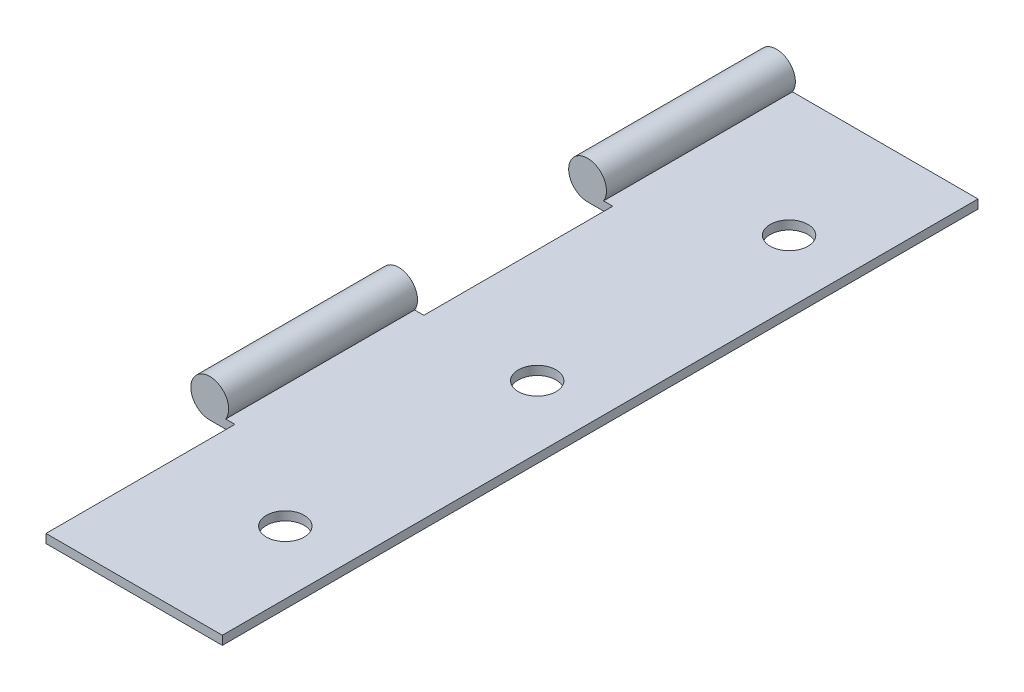
ISO-10303-21;
HEADER;
FILE_DESCRIPTION(('STEP AP214'),'2;1');
FILE_NAME('part.step','',(''),(''),'','','');
FILE_SCHEMA(('AUTOMOTIVE_DESIGN { 1 0 10303 214 1 1 1 1 }'));
ENDSEC;
DATA;
#1=APPLICATION_CONTEXT('core data for automotive mechanical design processes');
#2=APPLICATION_PROTOCOL_DEFINITION('international standard','automotive_design',2000,#1);
#3=PRODUCT_CONTEXT('',#1,'mechanical');
#4=PRODUCT('Part','Part','',(#3));
#5=PRODUCT_RELATED_PRODUCT_CATEGORY('part','',(#4));
#6=PRODUCT_DEFINITION_FORMATION('','',#4);
#7=PRODUCT_DEFINITION_CONTEXT('part definition',#1,'design');
#8=PRODUCT_DEFINITION('design','',#6,#7);
#9=PRODUCT_DEFINITION_SHAPE('','',#8);
#10=(LENGTH_UNIT() NAMED_UNIT(*) SI_UNIT(.MILLI.,.METRE.));
#11=(NAMED_UNIT(*) PLANE_ANGLE_UNIT() SI_UNIT($,.RADIAN.));
#12=(NAMED_UNIT(*) SI_UNIT($,.STERADIAN.) SOLID_ANGLE_UNIT());
#13=UNCERTAINTY_MEASURE_WITH_UNIT(LENGTH_MEASURE(1.E-05),#10,'distance_accuracy_value','');
#14=(GEOMETRIC_REPRESENTATION_CONTEXT(3) GLOBAL_UNCERTAINTY_ASSIGNED_CONTEXT((#13)) GLOBAL_UNIT_ASSIGNED_CONTEXT((#10,
#11,#12)) REPRESENTATION_CONTEXT('',''));
#15=CARTESIAN_POINT('',(0.,0.,0.));
#16=DIRECTION('',(0.,0.,1.));
#17=DIRECTION('',(1.,0.,0.));
#18=AXIS2_PLACEMENT_3D('',#15,#16,#17);
#19=CARTESIAN_POINT('',(0.,1.5,60.));
#20=DIRECTION('',(0.,0.,-1.));
#21=DIRECTION('',(-1.,0.,0.));
#22=AXIS2_PLACEMENT_3D('',#19,#20,#21);
#23=CYLINDRICAL_SURFACE('',#22,1.5);
#24=CARTESIAN_POINT('',(0.,1.5,15.));
#25=DIRECTION('',(0.,0.,1.));
#26=DIRECTION('',(1.,0.,0.));
#27=AXIS2_PLACEMENT_3D('',#24,#25,#26);
#28=CIRCLE('',#27,1.5);
#29=CARTESIAN_POINT('',(1.26885775404495,0.7,15.));
#30=VERTEX_POINT('',#29);
#31=CARTESIAN_POINT('',(0.,0.,15.));
#32=VERTEX_POINT('',#31);
#33=EDGE_CURVE('E238',#30,#32,#28,.T.);
#34=ORIENTED_EDGE('',*,*,#33,.F.);
#35=DIRECTION('',(0.,0.,-1.));
#36=VECTOR('',#35,1.);
#37=CARTESIAN_POINT('',(1.26885775404495,0.7,60.));
#38=LINE('',#37,#36);
#39=CARTESIAN_POINT('',(1.26885775404495,0.7,0.));
#40=VERTEX_POINT('',#39);
#41=EDGE_CURVE('E209',#30,#40,#38,.T.);
#42=ORIENTED_EDGE('',*,*,#41,.T.);
#43=CARTESIAN_POINT('',(0.,1.5,0.));
#44=DIRECTION('',(0.,0.,1.));
#45=DIRECTION('',(1.,0.,0.));
#46=AXIS2_PLACEMENT_3D('',#43,#44,#45);
#47=CIRCLE('',#46,1.5);
#48=CARTESIAN_POINT('',(0.,0.,0.));
#49=VERTEX_POINT('',#48);
#50=EDGE_CURVE('E202',#40,#49,#47,.T.);
#51=ORIENTED_EDGE('',*,*,#50,.T.);
#52=DIRECTION('',(0.,0.,-1.));
#53=VECTOR('',#52,1.);
#54=CARTESIAN_POINT('',(0.,0.,60.));
#55=LINE('',#54,#53);
#56=EDGE_CURVE('E212',#32,#49,#55,.T.);
#57=ORIENTED_EDGE('',*,*,#56,.F.);
#58=EDGE_LOOP('',(#34,#42,#51,#57));
#59=FACE_BOUND('',#58,.T.);
#60=ADVANCED_FACE('F31',(#59),#23,.T.);
#61=CARTESIAN_POINT('',(1.26885775404495,0.7,45.));
#62=VERTEX_POINT('',#61);
#63=CARTESIAN_POINT('',(1.26885775404495,0.7,30.));
#64=VERTEX_POINT('',#63);
#65=EDGE_CURVE('E199',#62,#64,#38,.T.);
#66=ORIENTED_EDGE('',*,*,#65,.T.);
#67=CARTESIAN_POINT('',(0.,1.5,30.));
#68=DIRECTION('',(0.,0.,-1.));
#69=DIRECTION('',(-1.,0.,0.));
#70=AXIS2_PLACEMENT_3D('',#67,#68,#69);
#71=CIRCLE('',#70,1.5);
#72=CARTESIAN_POINT('',(0.,0.,30.));
#73=VERTEX_POINT('',#72);
#74=EDGE_CURVE('E46',#73,#64,#71,.T.);
#75=ORIENTED_EDGE('',*,*,#74,.F.);
#76=CARTESIAN_POINT('',(0.,0.,45.));
#77=VERTEX_POINT('',#76);
#78=EDGE_CURVE('E213',#77,#73,#55,.T.);
#79=ORIENTED_EDGE('',*,*,#78,.F.);
#80=CARTESIAN_POINT('',(0.,1.5,45.));
#81=DIRECTION('',(0.,0.,1.));
#82=DIRECTION('',(1.,0.,0.));
#83=AXIS2_PLACEMENT_3D('',#80,#81,#82);
#84=CIRCLE('',#83,1.5);
#85=EDGE_CURVE('E221',#62,#77,#84,.T.);
#86=ORIENTED_EDGE('',*,*,#85,.F.);
#87=EDGE_LOOP('',(#66,#75,#79,#86));
#88=FACE_BOUND('',#87,.T.);
#89=ADVANCED_FACE('F158',(#88),#23,.T.);
#90=CARTESIAN_POINT('',(0.,0.,60.));
#91=DIRECTION('',(0.,1.,0.));
#92=DIRECTION('',(0.,0.,1.));
#93=AXIS2_PLACEMENT_3D('',#90,#91,#92);
#94=PLANE('',#93);
#95=CARTESIAN_POINT('',(11.,0.,30.));
#96=DIRECTION('',(0.,1.,0.));
#97=DIRECTION('',(-1.,0.,0.));
#98=AXIS2_PLACEMENT_3D('',#95,#96,#97);
#99=CIRCLE('',#98,1.5);
#100=CARTESIAN_POINT('',(9.5,0.,30.));
#101=VERTEX_POINT('',#100);
#102=EDGE_CURVE('E275',#101,#101,#99,.T.);
#103=ORIENTED_EDGE('',*,*,#102,.T.);
#104=EDGE_LOOP('',(#103));
#105=FACE_BOUND('',#104,.T.);
#106=CARTESIAN_POINT('',(11.,0.,50.));
#107=DIRECTION('',(0.,1.,0.));
#108=DIRECTION('',(-1.,0.,0.));
#109=AXIS2_PLACEMENT_3D('',#106,#107,#108);
#110=CIRCLE('',#109,1.5);
#111=CARTESIAN_POINT('',(9.5,0.,50.));
#112=VERTEX_POINT('',#111);
#113=EDGE_CURVE('E126',#112,#112,#110,.T.);
#114=ORIENTED_EDGE('',*,*,#113,.T.);
#115=EDGE_LOOP('',(#114));
#116=FACE_BOUND('',#115,.T.);
#117=DIRECTION('',(1.,0.,0.));
#118=VECTOR('',#117,1.);
#119=CARTESIAN_POINT('',(0.,0.,15.));
#120=LINE('',#119,#118);
#121=CARTESIAN_POINT('',(2.,0.,15.));
#122=VERTEX_POINT('',#121);
#123=EDGE_CURVE('E240',#32,#122,#120,.T.);
#124=ORIENTED_EDGE('',*,*,#123,.F.);
#125=ORIENTED_EDGE('',*,*,#56,.T.);
#126=DIRECTION('',(1.,0.,0.));
#127=VECTOR('',#126,1.);
#128=CARTESIAN_POINT('',(0.,0.,0.));
#129=LINE('',#128,#127);
#130=CARTESIAN_POINT('',(16.,0.,0.));
#131=VERTEX_POINT('',#130);
#132=EDGE_CURVE('E192',#49,#131,#129,.T.);
#133=ORIENTED_EDGE('',*,*,#132,.T.);
#134=DIRECTION('',(0.,0.,-1.));
#135=VECTOR('',#134,1.);
#136=CARTESIAN_POINT('',(16.,0.,60.));
#137=LINE('',#136,#135);
#138=CARTESIAN_POINT('',(16.,0.,60.));
#139=VERTEX_POINT('',#138);
#140=EDGE_CURVE('E188',#139,#131,#137,.T.);
#141=ORIENTED_EDGE('',*,*,#140,.F.);
#142=DIRECTION('',(1.,0.,0.));
#143=VECTOR('',#142,1.);
#144=CARTESIAN_POINT('',(0.,0.,60.));
#145=LINE('',#144,#143);
#146=CARTESIAN_POINT('',(2.,0.,60.));
#147=VERTEX_POINT('',#146);
#148=EDGE_CURVE('E203',#147,#139,#145,.T.);
#149=ORIENTED_EDGE('',*,*,#148,.F.);
#150=DIRECTION('',(0.,0.,1.));
#151=VECTOR('',#150,1.);
#152=CARTESIAN_POINT('',(2.,0.,60.));
#153=LINE('',#152,#151);
#154=CARTESIAN_POINT('',(2.,0.,45.));
#155=VERTEX_POINT('',#154);
#156=EDGE_CURVE('E54',#155,#147,#153,.T.);
#157=ORIENTED_EDGE('',*,*,#156,.F.);
#158=DIRECTION('',(1.,0.,0.));
#159=VECTOR('',#158,1.);
#160=CARTESIAN_POINT('',(0.,0.,45.));
#161=LINE('',#160,#159);
#162=EDGE_CURVE('E225',#77,#155,#161,.T.);
#163=ORIENTED_EDGE('',*,*,#162,.F.);
#164=ORIENTED_EDGE('',*,*,#78,.T.);
#165=DIRECTION('',(-1.,0.,0.));
#166=VECTOR('',#165,1.);
#167=CARTESIAN_POINT('',(0.,0.,30.));
#168=LINE('',#167,#166);
#169=CARTESIAN_POINT('',(2.,0.,30.));
#170=VERTEX_POINT('',#169);
#171=EDGE_CURVE('E241',#170,#73,#168,.T.);
#172=ORIENTED_EDGE('',*,*,#171,.F.);
#173=DIRECTION('',(0.,0.,1.));
#174=VECTOR('',#173,1.);
#175=CARTESIAN_POINT('',(2.,0.,60.));
#176=LINE('',#175,#174);
#177=EDGE_CURVE('E124',#122,#170,#176,.T.);
#178=ORIENTED_EDGE('',*,*,#177,.F.);
#179=EDGE_LOOP('',(#124,#125,#133,#141,#149,#157,#163,#164,#172,#178));
#180=FACE_BOUND('',#179,.T.);
#181=CARTESIAN_POINT('',(11.,0.,9.99999999999999));
#182=DIRECTION('',(0.,1.,0.));
#183=DIRECTION('',(-1.,0.,0.));
#184=AXIS2_PLACEMENT_3D('',#181,#182,#183);
#185=CIRCLE('',#184,1.5);
#186=CARTESIAN_POINT('',(9.5,0.,9.99999999999999));
#187=VERTEX_POINT('',#186);
#188=EDGE_CURVE('E39',#187,#187,#185,.T.);
#189=ORIENTED_EDGE('',*,*,#188,.T.);
#190=EDGE_LOOP('',(#189));
#191=FACE_BOUND('',#190,.T.);
#192=ADVANCED_FACE('F140',(#105,#116,#180,#191),#94,.F.);
#193=CARTESIAN_POINT('',(1.26885775404495,0.7,60.));
#194=DIRECTION('',(0.,-1.,0.));
#195=DIRECTION('',(1.,0.,0.));
#196=AXIS2_PLACEMENT_3D('',#193,#194,#195);
#197=PLANE('',#196);
#198=CARTESIAN_POINT('',(11.,0.7,30.));
#199=DIRECTION('',(0.,1.,0.));
#200=DIRECTION('',(-1.,0.,0.));
#201=AXIS2_PLACEMENT_3D('',#198,#199,#200);
#202=CIRCLE('',#201,1.5);
#203=CARTESIAN_POINT('',(9.5,0.7,30.));
#204=VERTEX_POINT('',#203);
#205=EDGE_CURVE('E277',#204,#204,#202,.T.);
#206=ORIENTED_EDGE('',*,*,#205,.F.);
#207=EDGE_LOOP('',(#206));
#208=FACE_BOUND('',#207,.T.);
#209=CARTESIAN_POINT('',(11.,0.7,50.));
#210=DIRECTION('',(0.,1.,0.));
#211=DIRECTION('',(-1.,0.,0.));
#212=AXIS2_PLACEMENT_3D('',#209,#210,#211);
#213=CIRCLE('',#212,1.5);
#214=CARTESIAN_POINT('',(9.5,0.7,50.));
#215=VERTEX_POINT('',#214);
#216=EDGE_CURVE('E278',#215,#215,#213,.T.);
#217=ORIENTED_EDGE('',*,*,#216,.F.);
#218=EDGE_LOOP('',(#217));
#219=FACE_BOUND('',#218,.T.);
#220=DIRECTION('',(-1.,0.,0.));
#221=VECTOR('',#220,1.);
#222=CARTESIAN_POINT('',(1.26885775404495,0.7,15.));
#223=LINE('',#222,#221);
#224=CARTESIAN_POINT('',(2.,0.7,15.));
#225=VERTEX_POINT('',#224);
#226=EDGE_CURVE('E133',#225,#30,#223,.T.);
#227=ORIENTED_EDGE('',*,*,#226,.F.);
#228=DIRECTION('',(0.,0.,-1.));
#229=VECTOR('',#228,1.);
#230=CARTESIAN_POINT('',(2.,0.7,60.));
#231=LINE('',#230,#229);
#232=CARTESIAN_POINT('',(2.,0.7,30.));
#233=VERTEX_POINT('',#232);
#234=EDGE_CURVE('E116',#233,#225,#231,.T.);
#235=ORIENTED_EDGE('',*,*,#234,.F.);
#236=DIRECTION('',(1.,0.,0.));
#237=VECTOR('',#236,1.);
#238=CARTESIAN_POINT('',(1.26885775404495,0.7,30.));
#239=LINE('',#238,#237);
#240=EDGE_CURVE('E107',#64,#233,#239,.T.);
#241=ORIENTED_EDGE('',*,*,#240,.F.);
#242=ORIENTED_EDGE('',*,*,#65,.F.);
#243=DIRECTION('',(-1.,0.,0.));
#244=VECTOR('',#243,1.);
#245=CARTESIAN_POINT('',(1.26885775404495,0.7,45.));
#246=LINE('',#245,#244);
#247=CARTESIAN_POINT('',(2.,0.7,45.));
#248=VERTEX_POINT('',#247);
#249=EDGE_CURVE('E117',#248,#62,#246,.T.);
#250=ORIENTED_EDGE('',*,*,#249,.F.);
#251=DIRECTION('',(0.,0.,-1.));
#252=VECTOR('',#251,1.);
#253=CARTESIAN_POINT('',(2.,0.7,60.));
#254=LINE('',#253,#252);
#255=CARTESIAN_POINT('',(2.,0.7,60.));
#256=VERTEX_POINT('',#255);
#257=EDGE_CURVE('E228',#256,#248,#254,.T.);
#258=ORIENTED_EDGE('',*,*,#257,.F.);
#259=DIRECTION('',(-1.,0.,0.));
#260=VECTOR('',#259,1.);
#261=CARTESIAN_POINT('',(1.26885775404495,0.7,60.));
#262=LINE('',#261,#260);
#263=CARTESIAN_POINT('',(16.,0.7,60.));
#264=VERTEX_POINT('',#263);
#265=EDGE_CURVE('E198',#264,#256,#262,.T.);
#266=ORIENTED_EDGE('',*,*,#265,.F.);
#267=DIRECTION('',(0.,0.,-1.));
#268=VECTOR('',#267,1.);
#269=CARTESIAN_POINT('',(16.,0.7,60.));
#270=LINE('',#269,#268);
#271=CARTESIAN_POINT('',(16.,0.7,0.));
#272=VERTEX_POINT('',#271);
#273=EDGE_CURVE('E185',#264,#272,#270,.T.);
#274=ORIENTED_EDGE('',*,*,#273,.T.);
#275=DIRECTION('',(-1.,0.,0.));
#276=VECTOR('',#275,1.);
#277=CARTESIAN_POINT('',(1.26885775404495,0.7,0.));
#278=LINE('',#277,#276);
#279=EDGE_CURVE('E191',#272,#40,#278,.T.);
#280=ORIENTED_EDGE('',*,*,#279,.T.);
#281=ORIENTED_EDGE('',*,*,#41,.F.);
#282=EDGE_LOOP('',(#227,#235,#241,#242,#250,#258,#266,#274,#280,#281));
#283=FACE_BOUND('',#282,.T.);
#284=CARTESIAN_POINT('',(11.,0.7,9.99999999999999));
#285=DIRECTION('',(0.,1.,0.));
#286=DIRECTION('',(-1.,0.,0.));
#287=AXIS2_PLACEMENT_3D('',#284,#285,#286);
#288=CIRCLE('',#287,1.5);
#289=CARTESIAN_POINT('',(9.5,0.7,9.99999999999999));
#290=VERTEX_POINT('',#289);
#291=EDGE_CURVE('E11',#290,#290,#288,.T.);
#292=ORIENTED_EDGE('',*,*,#291,.F.);
#293=EDGE_LOOP('',(#292));
#294=FACE_BOUND('',#293,.T.);
#295=ADVANCED_FACE('F129',(#208,#219,#283,#294),#197,.F.);
#296=CARTESIAN_POINT('',(0.,1.5,60.));
#297=DIRECTION('',(0.,0.,1.));
#298=DIRECTION('',(1.,0.,0.));
#299=AXIS2_PLACEMENT_3D('',#296,#297,#298);
#300=PLANE('',#299);
#301=ORIENTED_EDGE('',*,*,#265,.T.);
#302=DIRECTION('',(0.,-1.,0.));
#303=VECTOR('',#302,1.);
#304=CARTESIAN_POINT('',(2.,1.5,60.));
#305=LINE('',#304,#303);
#306=EDGE_CURVE('E216',#256,#147,#305,.T.);
#307=ORIENTED_EDGE('',*,*,#306,.T.);
#308=ORIENTED_EDGE('',*,*,#148,.T.);
#309=DIRECTION('',(0.,1.,0.));
#310=VECTOR('',#309,1.);
#311=CARTESIAN_POINT('',(16.,0.,60.));
#312=LINE('',#311,#310);
#313=EDGE_CURVE('E205',#139,#264,#312,.T.);
#314=ORIENTED_EDGE('',*,*,#313,.T.);
#315=EDGE_LOOP('',(#301,#307,#308,#314));
#316=FACE_BOUND('',#315,.T.);
#317=ADVANCED_FACE('F147',(#316),#300,.T.);
#318=CARTESIAN_POINT('',(16.,0.,60.));
#319=DIRECTION('',(-1.,0.,0.));
#320=DIRECTION('',(0.,0.,1.));
#321=AXIS2_PLACEMENT_3D('',#318,#319,#320);
#322=PLANE('',#321);
#323=DIRECTION('',(0.,1.,0.));
#324=VECTOR('',#323,1.);
#325=CARTESIAN_POINT('',(16.,0.,0.));
#326=LINE('',#325,#324);
#327=EDGE_CURVE('E182',#131,#272,#326,.T.);
#328=ORIENTED_EDGE('',*,*,#327,.T.);
#329=ORIENTED_EDGE('',*,*,#273,.F.);
#330=ORIENTED_EDGE('',*,*,#313,.F.);
#331=ORIENTED_EDGE('',*,*,#140,.T.);
#332=EDGE_LOOP('',(#328,#329,#330,#331));
#333=FACE_BOUND('',#332,.T.);
#334=ADVANCED_FACE('F155',(#333),#322,.F.);
#335=CARTESIAN_POINT('',(0.,1.5,0.));
#336=DIRECTION('',(0.,0.,1.));
#337=DIRECTION('',(1.,0.,0.));
#338=AXIS2_PLACEMENT_3D('',#335,#336,#337);
#339=PLANE('',#338);
#340=ORIENTED_EDGE('',*,*,#50,.F.);
#341=ORIENTED_EDGE('',*,*,#279,.F.);
#342=ORIENTED_EDGE('',*,*,#327,.F.);
#343=ORIENTED_EDGE('',*,*,#132,.F.);
#344=EDGE_LOOP('',(#340,#341,#342,#343));
#345=FACE_BOUND('',#344,.T.);
#346=ADVANCED_FACE('F172',(#345),#339,.F.);
#347=CARTESIAN_POINT('',(2.,3.,45.));
#348=DIRECTION('',(0.,0.,1.));
#349=DIRECTION('',(1.,0.,0.));
#350=AXIS2_PLACEMENT_3D('',#347,#348,#349);
#351=PLANE('',#350);
#352=ORIENTED_EDGE('',*,*,#162,.T.);
#353=DIRECTION('',(0.,-1.,0.));
#354=VECTOR('',#353,1.);
#355=CARTESIAN_POINT('',(2.,3.,45.));
#356=LINE('',#355,#354);
#357=EDGE_CURVE('E223',#248,#155,#356,.T.);
#358=ORIENTED_EDGE('',*,*,#357,.F.);
#359=ORIENTED_EDGE('',*,*,#249,.T.);
#360=ORIENTED_EDGE('',*,*,#85,.T.);
#361=EDGE_LOOP('',(#352,#358,#359,#360));
#362=FACE_BOUND('',#361,.T.);
#363=ADVANCED_FACE('F177',(#362),#351,.T.);
#364=CARTESIAN_POINT('',(2.,3.,60.));
#365=DIRECTION('',(-1.,0.,0.));
#366=DIRECTION('',(0.,-1.,0.));
#367=AXIS2_PLACEMENT_3D('',#364,#365,#366);
#368=PLANE('',#367);
#369=ORIENTED_EDGE('',*,*,#156,.T.);
#370=ORIENTED_EDGE('',*,*,#306,.F.);
#371=ORIENTED_EDGE('',*,*,#257,.T.);
#372=ORIENTED_EDGE('',*,*,#357,.T.);
#373=EDGE_LOOP('',(#369,#370,#371,#372));
#374=FACE_BOUND('',#373,.T.);
#375=ADVANCED_FACE('F251',(#374),#368,.T.);
#376=CARTESIAN_POINT('',(2.,3.,30.));
#377=DIRECTION('',(-1.,0.,0.));
#378=DIRECTION('',(0.,-1.,0.));
#379=AXIS2_PLACEMENT_3D('',#376,#377,#378);
#380=PLANE('',#379);
#381=ORIENTED_EDGE('',*,*,#177,.T.);
#382=DIRECTION('',(0.,-1.,0.));
#383=VECTOR('',#382,1.);
#384=CARTESIAN_POINT('',(2.,3.,30.));
#385=LINE('',#384,#383);
#386=EDGE_CURVE('E110',#233,#170,#385,.T.);
#387=ORIENTED_EDGE('',*,*,#386,.F.);
#388=ORIENTED_EDGE('',*,*,#234,.T.);
#389=DIRECTION('',(0.,-1.,0.));
#390=VECTOR('',#389,1.);
#391=CARTESIAN_POINT('',(2.,3.,15.));
#392=LINE('',#391,#390);
#393=EDGE_CURVE('E125',#225,#122,#392,.T.);
#394=ORIENTED_EDGE('',*,*,#393,.T.);
#395=EDGE_LOOP('',(#381,#387,#388,#394));
#396=FACE_BOUND('',#395,.T.);
#397=ADVANCED_FACE('F120',(#396),#380,.T.);
#398=CARTESIAN_POINT('',(2.,3.,15.));
#399=DIRECTION('',(0.,0.,1.));
#400=DIRECTION('',(1.,0.,0.));
#401=AXIS2_PLACEMENT_3D('',#398,#399,#400);
#402=PLANE('',#401);
#403=ORIENTED_EDGE('',*,*,#123,.T.);
#404=ORIENTED_EDGE('',*,*,#393,.F.);
#405=ORIENTED_EDGE('',*,*,#226,.T.);
#406=ORIENTED_EDGE('',*,*,#33,.T.);
#407=EDGE_LOOP('',(#403,#404,#405,#406));
#408=FACE_BOUND('',#407,.T.);
#409=ADVANCED_FACE('F243',(#408),#402,.T.);
#410=CARTESIAN_POINT('',(2.,3.,30.));
#411=DIRECTION('',(0.,0.,-1.));
#412=DIRECTION('',(-1.,0.,0.));
#413=AXIS2_PLACEMENT_3D('',#410,#411,#412);
#414=PLANE('',#413);
#415=ORIENTED_EDGE('',*,*,#171,.T.);
#416=ORIENTED_EDGE('',*,*,#74,.T.);
#417=ORIENTED_EDGE('',*,*,#240,.T.);
#418=ORIENTED_EDGE('',*,*,#386,.T.);
#419=EDGE_LOOP('',(#415,#416,#417,#418));
#420=FACE_BOUND('',#419,.T.);
#421=ADVANCED_FACE('F109',(#420),#414,.T.);
#422=CARTESIAN_POINT('',(11.,0.,50.));
#423=DIRECTION('',(0.,1.,0.));
#424=DIRECTION('',(-1.,0.,0.));
#425=AXIS2_PLACEMENT_3D('',#422,#423,#424);
#426=CYLINDRICAL_SURFACE('',#425,1.5);
#427=ORIENTED_EDGE('',*,*,#113,.F.);
#428=EDGE_LOOP('',(#427));
#429=FACE_BOUND('',#428,.T.);
#430=ORIENTED_EDGE('',*,*,#216,.T.);
#431=EDGE_LOOP('',(#430));
#432=FACE_BOUND('',#431,.T.);
#433=ADVANCED_FACE('F265',(#429,#432),#426,.F.);
#434=CARTESIAN_POINT('',(11.,0.,30.));
#435=DIRECTION('',(0.,1.,0.));
#436=DIRECTION('',(-1.,0.,0.));
#437=AXIS2_PLACEMENT_3D('',#434,#435,#436);
#438=CYLINDRICAL_SURFACE('',#437,1.5);
#439=ORIENTED_EDGE('',*,*,#102,.F.);
#440=EDGE_LOOP('',(#439));
#441=FACE_BOUND('',#440,.T.);
#442=ORIENTED_EDGE('',*,*,#205,.T.);
#443=EDGE_LOOP('',(#442));
#444=FACE_BOUND('',#443,.T.);
#445=ADVANCED_FACE('F144',(#441,#444),#438,.F.);
#446=CARTESIAN_POINT('',(11.,0.,9.99999999999999));
#447=DIRECTION('',(0.,1.,0.));
#448=DIRECTION('',(-1.,0.,0.));
#449=AXIS2_PLACEMENT_3D('',#446,#447,#448);
#450=CYLINDRICAL_SURFACE('',#449,1.5);
#451=ORIENTED_EDGE('',*,*,#188,.F.);
#452=EDGE_LOOP('',(#451));
#453=FACE_BOUND('',#452,.T.);
#454=ORIENTED_EDGE('',*,*,#291,.T.);
#455=EDGE_LOOP('',(#454));
#456=FACE_BOUND('',#455,.T.);
#457=ADVANCED_FACE('F33',(#453,#456),#450,.F.);
#458=CLOSED_SHELL('',(#60,#89,#192,#295,#317,#334,#346,#363,#375,#397,#409,#421,#433,#445,#457));
#459=MANIFOLD_SOLID_BREP('B2',#458);
#460=ADVANCED_BREP_SHAPE_REPRESENTATION('',(#18,#459),#14);
#461=SHAPE_DEFINITION_REPRESENTATION(#9,#460);
ENDSEC;
END-ISO-10303-21;
